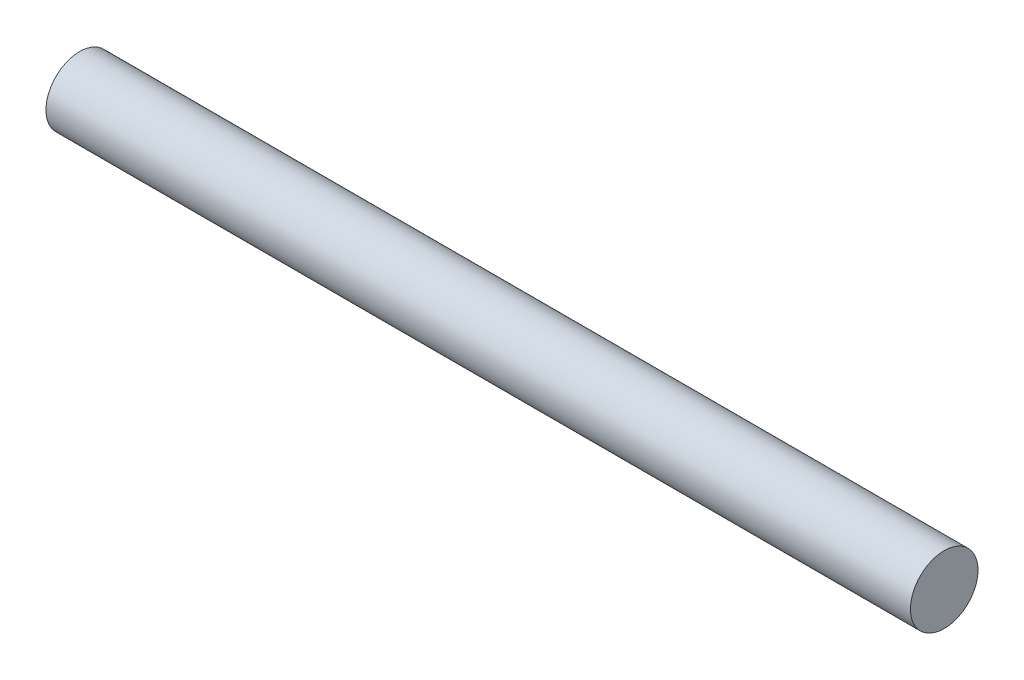
ISO-10303-21;
HEADER;
FILE_DESCRIPTION(('STEP AP214'),'2;1');
FILE_NAME('part.step','',(''),(''),'','','');
FILE_SCHEMA(('AUTOMOTIVE_DESIGN { 1 0 10303 214 1 1 1 1 }'));
ENDSEC;
DATA;
#1=APPLICATION_CONTEXT('core data for automotive mechanical design processes');
#2=APPLICATION_PROTOCOL_DEFINITION('international standard','automotive_design',2000,#1);
#3=PRODUCT_CONTEXT('',#1,'mechanical');
#4=PRODUCT('Part','Part','',(#3));
#5=PRODUCT_RELATED_PRODUCT_CATEGORY('part','',(#4));
#6=PRODUCT_DEFINITION_FORMATION('','',#4);
#7=PRODUCT_DEFINITION_CONTEXT('part definition',#1,'design');
#8=PRODUCT_DEFINITION('design','',#6,#7);
#9=PRODUCT_DEFINITION_SHAPE('','',#8);
#10=(LENGTH_UNIT() NAMED_UNIT(*) SI_UNIT(.MILLI.,.METRE.));
#11=(NAMED_UNIT(*) PLANE_ANGLE_UNIT() SI_UNIT($,.RADIAN.));
#12=(NAMED_UNIT(*) SI_UNIT($,.STERADIAN.) SOLID_ANGLE_UNIT());
#13=UNCERTAINTY_MEASURE_WITH_UNIT(LENGTH_MEASURE(1.E-05),#10,'distance_accuracy_value','');
#14=(GEOMETRIC_REPRESENTATION_CONTEXT(3) GLOBAL_UNCERTAINTY_ASSIGNED_CONTEXT((#13)) GLOBAL_UNIT_ASSIGNED_CONTEXT((#10,
#11,#12)) REPRESENTATION_CONTEXT('',''));
#15=CARTESIAN_POINT('',(0.,0.,0.));
#16=DIRECTION('',(0.,0.,1.));
#17=DIRECTION('',(1.,0.,0.));
#18=AXIS2_PLACEMENT_3D('',#15,#16,#17);
#19=CARTESIAN_POINT('',(320.,0.,0.));
#20=DIRECTION('',(-1.,0.,0.));
#21=DIRECTION('',(0.,0.,1.));
#22=AXIS2_PLACEMENT_3D('',#19,#20,#21);
#23=CYLINDRICAL_SURFACE('',#22,12.5);
#24=CARTESIAN_POINT('',(320.,0.,0.));
#25=DIRECTION('',(1.,0.,0.));
#26=DIRECTION('',(0.,0.,-1.));
#27=AXIS2_PLACEMENT_3D('',#24,#25,#26);
#28=CIRCLE('',#27,12.5);
#29=CARTESIAN_POINT('',(320.,0.,-12.5));
#30=VERTEX_POINT('',#29);
#31=EDGE_CURVE('E10',#30,#30,#28,.T.);
#32=ORIENTED_EDGE('',*,*,#31,.F.);
#33=EDGE_LOOP('',(#32));
#34=FACE_BOUND('',#33,.T.);
#35=CARTESIAN_POINT('',(0.,0.,0.));
#36=DIRECTION('',(1.,0.,0.));
#37=DIRECTION('',(0.,0.,-1.));
#38=AXIS2_PLACEMENT_3D('',#35,#36,#37);
#39=CIRCLE('',#38,12.5);
#40=CARTESIAN_POINT('',(0.,0.,-12.5));
#41=VERTEX_POINT('',#40);
#42=EDGE_CURVE('E36',#41,#41,#39,.T.);
#43=ORIENTED_EDGE('',*,*,#42,.T.);
#44=EDGE_LOOP('',(#43));
#45=FACE_BOUND('',#44,.T.);
#46=ADVANCED_FACE('F33',(#34,#45),#23,.T.);
#47=CARTESIAN_POINT('',(320.,0.,0.));
#48=DIRECTION('',(1.,0.,0.));
#49=DIRECTION('',(0.,0.,-1.));
#50=AXIS2_PLACEMENT_3D('',#47,#48,#49);
#51=PLANE('',#50);
#52=ORIENTED_EDGE('',*,*,#31,.T.);
#53=EDGE_LOOP('',(#52));
#54=FACE_BOUND('',#53,.T.);
#55=ADVANCED_FACE('F48',(#54),#51,.T.);
#56=CARTESIAN_POINT('',(0.,0.,0.));
#57=DIRECTION('',(1.,0.,0.));
#58=DIRECTION('',(0.,0.,-1.));
#59=AXIS2_PLACEMENT_3D('',#56,#57,#58);
#60=PLANE('',#59);
#61=ORIENTED_EDGE('',*,*,#42,.F.);
#62=EDGE_LOOP('',(#61));
#63=FACE_BOUND('',#62,.T.);
#64=ADVANCED_FACE('F46',(#63),#60,.F.);
#65=CLOSED_SHELL('',(#46,#55,#64));
#66=MANIFOLD_SOLID_BREP('B2',#65);
#67=ADVANCED_BREP_SHAPE_REPRESENTATION('',(#18,#66),#14);
#68=SHAPE_DEFINITION_REPRESENTATION(#9,#67);
ENDSEC;
END-ISO-10303-21;
